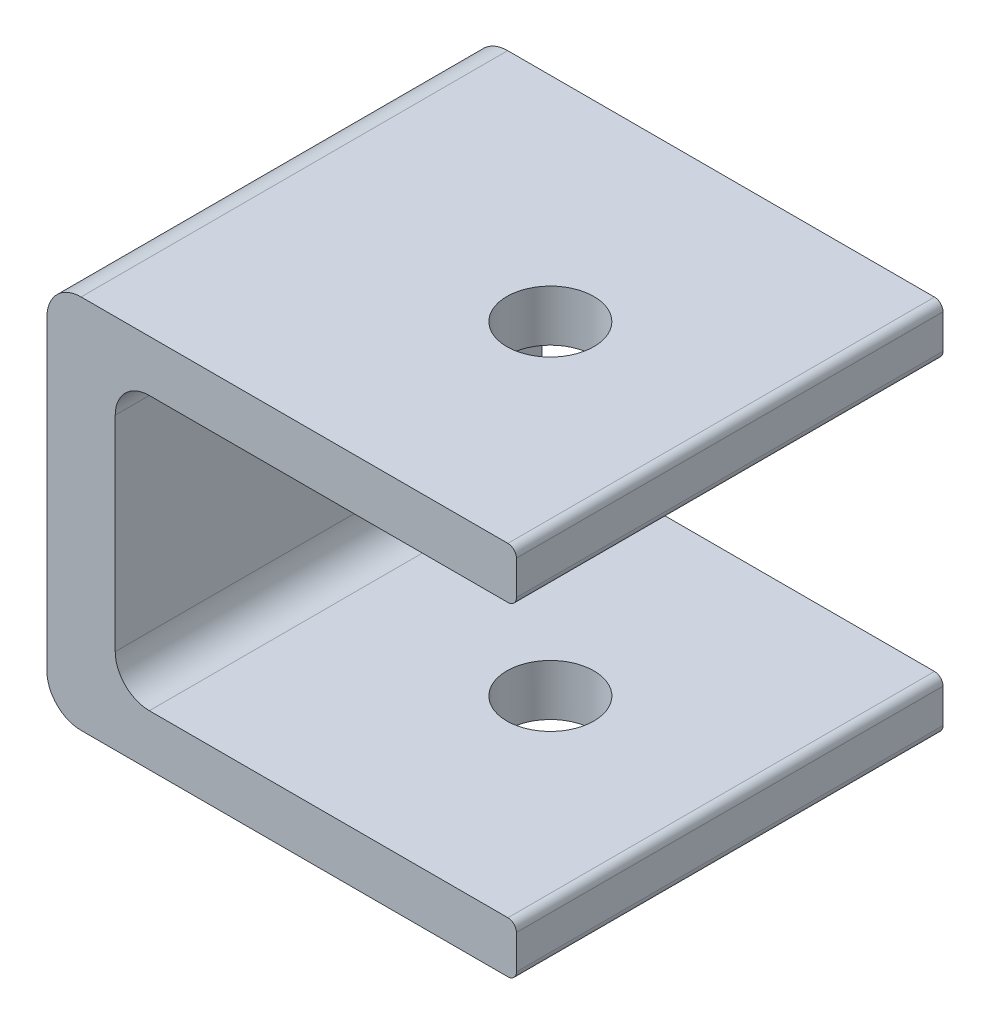
ISO-10303-21;
HEADER;
FILE_DESCRIPTION(('STEP AP214'),'2;1');
FILE_NAME('part.step','',(''),(''),'','','');
FILE_SCHEMA(('AUTOMOTIVE_DESIGN { 1 0 10303 214 1 1 1 1 }'));
ENDSEC;
DATA;
#1=APPLICATION_CONTEXT('core data for automotive mechanical design processes');
#2=APPLICATION_PROTOCOL_DEFINITION('international standard','automotive_design',2000,#1);
#3=PRODUCT_CONTEXT('',#1,'mechanical');
#4=PRODUCT('Part','Part','',(#3));
#5=PRODUCT_RELATED_PRODUCT_CATEGORY('part','',(#4));
#6=PRODUCT_DEFINITION_FORMATION('','',#4);
#7=PRODUCT_DEFINITION_CONTEXT('part definition',#1,'design');
#8=PRODUCT_DEFINITION('design','',#6,#7);
#9=PRODUCT_DEFINITION_SHAPE('','',#8);
#10=(LENGTH_UNIT() NAMED_UNIT(*) SI_UNIT(.MILLI.,.METRE.));
#11=(NAMED_UNIT(*) PLANE_ANGLE_UNIT() SI_UNIT($,.RADIAN.));
#12=(NAMED_UNIT(*) SI_UNIT($,.STERADIAN.) SOLID_ANGLE_UNIT());
#13=UNCERTAINTY_MEASURE_WITH_UNIT(LENGTH_MEASURE(1.E-05),#10,'distance_accuracy_value','');
#14=(GEOMETRIC_REPRESENTATION_CONTEXT(3) GLOBAL_UNCERTAINTY_ASSIGNED_CONTEXT((#13)) GLOBAL_UNIT_ASSIGNED_CONTEXT((#10,
#11,#12)) REPRESENTATION_CONTEXT('',''));
#15=CARTESIAN_POINT('',(0.,0.,0.));
#16=DIRECTION('',(0.,0.,1.));
#17=DIRECTION('',(1.,0.,0.));
#18=AXIS2_PLACEMENT_3D('',#15,#16,#17);
#19=CARTESIAN_POINT('',(0.,0.,25.));
#20=DIRECTION('',(-1.,0.,0.));
#21=DIRECTION('',(0.,-1.,0.));
#22=AXIS2_PLACEMENT_3D('',#19,#20,#21);
#23=PLANE('',#22);
#24=CARTESIAN_POINT('',(0.,-8.,12.5));
#25=DIRECTION('',(-1.,0.,0.));
#26=DIRECTION('',(0.,-1.,0.));
#27=AXIS2_PLACEMENT_3D('',#24,#25,#26);
#28=CIRCLE('',#27,2.55);
#29=CARTESIAN_POINT('',(0.,-10.55,12.5));
#30=VERTEX_POINT('',#29);
#31=EDGE_CURVE('E186',#30,#30,#28,.T.);
#32=ORIENTED_EDGE('',*,*,#31,.T.);
#33=EDGE_LOOP('',(#32));
#34=FACE_BOUND('',#33,.T.);
#35=DIRECTION('',(0.,1.,0.));
#36=VECTOR('',#35,1.);
#37=CARTESIAN_POINT('',(0.,0.,0.));
#38=LINE('',#37,#36);
#39=CARTESIAN_POINT('',(0.,-14.,0.));
#40=VERTEX_POINT('',#39);
#41=CARTESIAN_POINT('',(0.,-2.,0.));
#42=VERTEX_POINT('',#41);
#43=EDGE_CURVE('E185',#40,#42,#38,.T.);
#44=ORIENTED_EDGE('',*,*,#43,.T.);
#45=DIRECTION('',(0.,0.,-1.));
#46=VECTOR('',#45,1.);
#47=CARTESIAN_POINT('',(0.,-2.,25.));
#48=LINE('',#47,#46);
#49=CARTESIAN_POINT('',(0.,-2.,25.));
#50=VERTEX_POINT('',#49);
#51=EDGE_CURVE('E158',#42,#50,#48,.F.);
#52=ORIENTED_EDGE('',*,*,#51,.T.);
#53=DIRECTION('',(0.,1.,0.));
#54=VECTOR('',#53,1.);
#55=CARTESIAN_POINT('',(0.,0.,25.));
#56=LINE('',#55,#54);
#57=CARTESIAN_POINT('',(0.,-14.,25.));
#58=VERTEX_POINT('',#57);
#59=EDGE_CURVE('E202',#58,#50,#56,.T.);
#60=ORIENTED_EDGE('',*,*,#59,.F.);
#61=DIRECTION('',(0.,0.,-1.));
#62=VECTOR('',#61,1.);
#63=CARTESIAN_POINT('',(0.,-14.,0.));
#64=LINE('',#63,#62);
#65=EDGE_CURVE('E178',#58,#40,#64,.T.);
#66=ORIENTED_EDGE('',*,*,#65,.T.);
#67=EDGE_LOOP('',(#44,#52,#60,#66));
#68=FACE_BOUND('',#67,.T.);
#69=ADVANCED_FACE('F39',(#34,#68),#23,.F.);
#70=CARTESIAN_POINT('',(0.,0.,25.));
#71=DIRECTION('',(0.,1.,0.));
#72=DIRECTION('',(0.,0.,1.));
#73=AXIS2_PLACEMENT_3D('',#70,#71,#72);
#74=PLANE('',#73);
#75=CARTESIAN_POINT('',(13.,0.,12.5));
#76=DIRECTION('',(0.,1.,0.));
#77=DIRECTION('',(0.,0.,1.));
#78=AXIS2_PLACEMENT_3D('',#75,#76,#77);
#79=CIRCLE('',#78,2.55);
#80=CARTESIAN_POINT('',(13.,0.,15.05));
#81=VERTEX_POINT('',#80);
#82=EDGE_CURVE('E461',#81,#81,#79,.T.);
#83=ORIENTED_EDGE('',*,*,#82,.T.);
#84=EDGE_LOOP('',(#83));
#85=FACE_BOUND('',#84,.T.);
#86=DIRECTION('',(1.,0.,0.));
#87=VECTOR('',#86,1.);
#88=CARTESIAN_POINT('',(0.,0.,0.));
#89=LINE('',#88,#87);
#90=CARTESIAN_POINT('',(2.,0.,0.));
#91=VERTEX_POINT('',#90);
#92=CARTESIAN_POINT('',(23.0126202099511,0.,0.));
#93=VERTEX_POINT('',#92);
#94=EDGE_CURVE('E175',#91,#93,#89,.T.);
#95=ORIENTED_EDGE('',*,*,#94,.T.);
#96=DIRECTION('',(0.,0.,-1.));
#97=VECTOR('',#96,1.);
#98=CARTESIAN_POINT('',(23.0126202099512,0.,25.));
#99=LINE('',#98,#97);
#100=CARTESIAN_POINT('',(23.0126202099511,0.,25.));
#101=VERTEX_POINT('',#100);
#102=EDGE_CURVE('E48',#93,#101,#99,.F.);
#103=ORIENTED_EDGE('',*,*,#102,.T.);
#104=DIRECTION('',(1.,0.,0.));
#105=VECTOR('',#104,1.);
#106=CARTESIAN_POINT('',(0.,0.,25.));
#107=LINE('',#106,#105);
#108=CARTESIAN_POINT('',(2.,0.,25.));
#109=VERTEX_POINT('',#108);
#110=EDGE_CURVE('E172',#109,#101,#107,.T.);
#111=ORIENTED_EDGE('',*,*,#110,.F.);
#112=DIRECTION('',(0.,0.,-1.));
#113=VECTOR('',#112,1.);
#114=CARTESIAN_POINT('',(2.,0.,0.));
#115=LINE('',#114,#113);
#116=EDGE_CURVE('E159',#109,#91,#115,.T.);
#117=ORIENTED_EDGE('',*,*,#116,.T.);
#118=EDGE_LOOP('',(#95,#103,#111,#117));
#119=FACE_BOUND('',#118,.T.);
#120=ADVANCED_FACE('F173',(#85,#119),#74,.F.);
#121=CARTESIAN_POINT('',(23.5126202099512,0.,25.));
#122=DIRECTION('',(-1.,0.,0.));
#123=DIRECTION('',(0.,-1.,0.));
#124=AXIS2_PLACEMENT_3D('',#121,#122,#123);
#125=PLANE('',#124);
#126=DIRECTION('',(0.,1.,0.));
#127=VECTOR('',#126,1.);
#128=CARTESIAN_POINT('',(23.5126202099512,0.,25.));
#129=LINE('',#128,#127);
#130=CARTESIAN_POINT('',(23.5126202099512,0.5,25.));
#131=VERTEX_POINT('',#130);
#132=CARTESIAN_POINT('',(23.5126202099511,2.5,25.));
#133=VERTEX_POINT('',#132);
#134=EDGE_CURVE('E267',#131,#133,#129,.T.);
#135=ORIENTED_EDGE('',*,*,#134,.F.);
#136=DIRECTION('',(0.,0.,-1.));
#137=VECTOR('',#136,1.);
#138=CARTESIAN_POINT('',(23.5126202099512,0.5,25.));
#139=LINE('',#138,#137);
#140=CARTESIAN_POINT('',(23.5126202099512,0.5,0.));
#141=VERTEX_POINT('',#140);
#142=EDGE_CURVE('E263',#131,#141,#139,.T.);
#143=ORIENTED_EDGE('',*,*,#142,.T.);
#144=DIRECTION('',(0.,1.,0.));
#145=VECTOR('',#144,1.);
#146=CARTESIAN_POINT('',(23.5126202099512,0.,0.));
#147=LINE('',#146,#145);
#148=CARTESIAN_POINT('',(23.5126202099511,2.5,0.));
#149=VERTEX_POINT('',#148);
#150=EDGE_CURVE('E181',#141,#149,#147,.T.);
#151=ORIENTED_EDGE('',*,*,#150,.T.);
#152=DIRECTION('',(0.,0.,-1.));
#153=VECTOR('',#152,1.);
#154=CARTESIAN_POINT('',(23.5126202099511,2.5,25.));
#155=LINE('',#154,#153);
#156=EDGE_CURVE('E65',#149,#133,#155,.F.);
#157=ORIENTED_EDGE('',*,*,#156,.T.);
#158=EDGE_LOOP('',(#135,#143,#151,#157));
#159=FACE_BOUND('',#158,.T.);
#160=ADVANCED_FACE('F273',(#159),#125,.F.);
#161=CARTESIAN_POINT('',(0.,3.,25.));
#162=DIRECTION('',(0.,-1.,0.));
#163=DIRECTION('',(0.,0.,-1.));
#164=AXIS2_PLACEMENT_3D('',#161,#162,#163);
#165=PLANE('',#164);
#166=CARTESIAN_POINT('',(13.,3.,12.5));
#167=DIRECTION('',(0.,1.,0.));
#168=DIRECTION('',(0.,0.,1.));
#169=AXIS2_PLACEMENT_3D('',#166,#167,#168);
#170=CIRCLE('',#169,2.55);
#171=CARTESIAN_POINT('',(13.,3.,15.05));
#172=VERTEX_POINT('',#171);
#173=EDGE_CURVE('E464',#172,#172,#170,.T.);
#174=ORIENTED_EDGE('',*,*,#173,.F.);
#175=EDGE_LOOP('',(#174));
#176=FACE_BOUND('',#175,.T.);
#177=DIRECTION('',(-1.,0.,0.));
#178=VECTOR('',#177,1.);
#179=CARTESIAN_POINT('',(0.,3.,25.));
#180=LINE('',#179,#178);
#181=CARTESIAN_POINT('',(23.0126202099511,3.,25.));
#182=VERTEX_POINT('',#181);
#183=CARTESIAN_POINT('',(-2.,3.,25.));
#184=VERTEX_POINT('',#183);
#185=EDGE_CURVE('E278',#182,#184,#180,.T.);
#186=ORIENTED_EDGE('',*,*,#185,.F.);
#187=DIRECTION('',(0.,0.,-1.));
#188=VECTOR('',#187,1.);
#189=CARTESIAN_POINT('',(23.0126202099511,3.,25.));
#190=LINE('',#189,#188);
#191=CARTESIAN_POINT('',(23.0126202099511,3.,0.));
#192=VERTEX_POINT('',#191);
#193=EDGE_CURVE('E11',#182,#192,#190,.T.);
#194=ORIENTED_EDGE('',*,*,#193,.T.);
#195=DIRECTION('',(-1.,0.,0.));
#196=VECTOR('',#195,1.);
#197=CARTESIAN_POINT('',(0.,3.,0.));
#198=LINE('',#197,#196);
#199=CARTESIAN_POINT('',(-2.,3.,0.));
#200=VERTEX_POINT('',#199);
#201=EDGE_CURVE('E188',#192,#200,#198,.T.);
#202=ORIENTED_EDGE('',*,*,#201,.T.);
#203=DIRECTION('',(0.,0.,-1.));
#204=VECTOR('',#203,1.);
#205=CARTESIAN_POINT('',(-2.,3.,25.));
#206=LINE('',#205,#204);
#207=EDGE_CURVE('E166',#200,#184,#206,.F.);
#208=ORIENTED_EDGE('',*,*,#207,.T.);
#209=EDGE_LOOP('',(#186,#194,#202,#208));
#210=FACE_BOUND('',#209,.T.);
#211=ADVANCED_FACE('F277',(#176,#210),#165,.F.);
#212=CARTESIAN_POINT('',(-4.,3.,25.));
#213=DIRECTION('',(1.,0.,0.));
#214=DIRECTION('',(0.,1.,0.));
#215=AXIS2_PLACEMENT_3D('',#212,#213,#214);
#216=PLANE('',#215);
#217=CARTESIAN_POINT('',(-4.,-8.,12.5));
#218=DIRECTION('',(-1.,0.,0.));
#219=DIRECTION('',(0.,-1.,0.));
#220=AXIS2_PLACEMENT_3D('',#217,#218,#219);
#221=CIRCLE('',#220,2.55);
#222=CARTESIAN_POINT('',(-4.,-10.55,12.5));
#223=VERTEX_POINT('',#222);
#224=EDGE_CURVE('E468',#223,#223,#221,.T.);
#225=ORIENTED_EDGE('',*,*,#224,.F.);
#226=EDGE_LOOP('',(#225));
#227=FACE_BOUND('',#226,.T.);
#228=DIRECTION('',(0.,-1.,0.));
#229=VECTOR('',#228,1.);
#230=CARTESIAN_POINT('',(-4.,3.,0.));
#231=LINE('',#230,#229);
#232=CARTESIAN_POINT('',(-4.,1.,0.));
#233=VERTEX_POINT('',#232);
#234=CARTESIAN_POINT('',(-4.,-17.,0.));
#235=VERTEX_POINT('',#234);
#236=EDGE_CURVE('E193',#233,#235,#231,.T.);
#237=ORIENTED_EDGE('',*,*,#236,.T.);
#238=DIRECTION('',(0.,0.,-1.));
#239=VECTOR('',#238,1.);
#240=CARTESIAN_POINT('',(-4.,-17.,25.));
#241=LINE('',#240,#239);
#242=CARTESIAN_POINT('',(-4.,-17.,25.));
#243=VERTEX_POINT('',#242);
#244=EDGE_CURVE('E225',#235,#243,#241,.F.);
#245=ORIENTED_EDGE('',*,*,#244,.T.);
#246=DIRECTION('',(0.,-1.,0.));
#247=VECTOR('',#246,1.);
#248=CARTESIAN_POINT('',(-4.,3.,25.));
#249=LINE('',#248,#247);
#250=CARTESIAN_POINT('',(-4.,1.,25.));
#251=VERTEX_POINT('',#250);
#252=EDGE_CURVE('E285',#251,#243,#249,.T.);
#253=ORIENTED_EDGE('',*,*,#252,.F.);
#254=DIRECTION('',(0.,0.,-1.));
#255=VECTOR('',#254,1.);
#256=CARTESIAN_POINT('',(-4.,1.,25.));
#257=LINE('',#256,#255);
#258=EDGE_CURVE('E218',#251,#233,#257,.T.);
#259=ORIENTED_EDGE('',*,*,#258,.T.);
#260=EDGE_LOOP('',(#237,#245,#253,#259));
#261=FACE_BOUND('',#260,.T.);
#262=ADVANCED_FACE('F352',(#227,#261),#216,.F.);
#263=CARTESIAN_POINT('',(0.,-19.,25.));
#264=DIRECTION('',(0.,1.,0.));
#265=DIRECTION('',(0.,0.,1.));
#266=AXIS2_PLACEMENT_3D('',#263,#264,#265);
#267=PLANE('',#266);
#268=CARTESIAN_POINT('',(13.,-19.,12.5));
#269=DIRECTION('',(0.,1.,0.));
#270=DIRECTION('',(0.,0.,1.));
#271=AXIS2_PLACEMENT_3D('',#268,#269,#270);
#272=CIRCLE('',#271,2.55);
#273=CARTESIAN_POINT('',(13.,-19.,15.05));
#274=VERTEX_POINT('',#273);
#275=EDGE_CURVE('E458',#274,#274,#272,.T.);
#276=ORIENTED_EDGE('',*,*,#275,.T.);
#277=EDGE_LOOP('',(#276));
#278=FACE_BOUND('',#277,.T.);
#279=DIRECTION('',(1.,0.,0.));
#280=VECTOR('',#279,1.);
#281=CARTESIAN_POINT('',(0.,-19.,0.));
#282=LINE('',#281,#280);
#283=CARTESIAN_POINT('',(-2.,-19.,0.));
#284=VERTEX_POINT('',#283);
#285=CARTESIAN_POINT('',(23.0126202099511,-19.,0.));
#286=VERTEX_POINT('',#285);
#287=EDGE_CURVE('E196',#284,#286,#282,.T.);
#288=ORIENTED_EDGE('',*,*,#287,.T.);
#289=DIRECTION('',(0.,0.,-1.));
#290=VECTOR('',#289,1.);
#291=CARTESIAN_POINT('',(23.0126202099512,-19.,25.));
#292=LINE('',#291,#290);
#293=CARTESIAN_POINT('',(23.0126202099512,-19.,25.));
#294=VERTEX_POINT('',#293);
#295=EDGE_CURVE('E246',#286,#294,#292,.F.);
#296=ORIENTED_EDGE('',*,*,#295,.T.);
#297=DIRECTION('',(1.,0.,0.));
#298=VECTOR('',#297,1.);
#299=CARTESIAN_POINT('',(0.,-19.,25.));
#300=LINE('',#299,#298);
#301=CARTESIAN_POINT('',(-2.,-19.,25.));
#302=VERTEX_POINT('',#301);
#303=EDGE_CURVE('E283',#302,#294,#300,.T.);
#304=ORIENTED_EDGE('',*,*,#303,.F.);
#305=DIRECTION('',(0.,0.,-1.));
#306=VECTOR('',#305,1.);
#307=CARTESIAN_POINT('',(-2.,-19.,25.));
#308=LINE('',#307,#306);
#309=EDGE_CURVE('E214',#302,#284,#308,.T.);
#310=ORIENTED_EDGE('',*,*,#309,.T.);
#311=EDGE_LOOP('',(#288,#296,#304,#310));
#312=FACE_BOUND('',#311,.T.);
#313=ADVANCED_FACE('F358',(#278,#312),#267,.F.);
#314=CARTESIAN_POINT('',(23.5126202099512,-19.,25.));
#315=DIRECTION('',(-1.,0.,0.));
#316=DIRECTION('',(0.,-1.,0.));
#317=AXIS2_PLACEMENT_3D('',#314,#315,#316);
#318=PLANE('',#317);
#319=DIRECTION('',(0.,1.,0.));
#320=VECTOR('',#319,1.);
#321=CARTESIAN_POINT('',(23.5126202099512,-19.,25.));
#322=LINE('',#321,#320);
#323=CARTESIAN_POINT('',(23.5126202099512,-18.5,25.));
#324=VERTEX_POINT('',#323);
#325=CARTESIAN_POINT('',(23.5126202099511,-16.5,25.));
#326=VERTEX_POINT('',#325);
#327=EDGE_CURVE('E287',#324,#326,#322,.T.);
#328=ORIENTED_EDGE('',*,*,#327,.F.);
#329=DIRECTION('',(0.,0.,-1.));
#330=VECTOR('',#329,1.);
#331=CARTESIAN_POINT('',(23.5126202099512,-18.5,25.));
#332=LINE('',#331,#330);
#333=CARTESIAN_POINT('',(23.5126202099512,-18.5,0.));
#334=VERTEX_POINT('',#333);
#335=EDGE_CURVE('E240',#324,#334,#332,.T.);
#336=ORIENTED_EDGE('',*,*,#335,.T.);
#337=DIRECTION('',(0.,1.,0.));
#338=VECTOR('',#337,1.);
#339=CARTESIAN_POINT('',(23.5126202099512,-19.,0.));
#340=LINE('',#339,#338);
#341=CARTESIAN_POINT('',(23.5126202099511,-16.5,0.));
#342=VERTEX_POINT('',#341);
#343=EDGE_CURVE('E197',#334,#342,#340,.T.);
#344=ORIENTED_EDGE('',*,*,#343,.T.);
#345=DIRECTION('',(0.,0.,-1.));
#346=VECTOR('',#345,1.);
#347=CARTESIAN_POINT('',(23.5126202099511,-16.5,25.));
#348=LINE('',#347,#346);
#349=EDGE_CURVE('E239',#342,#326,#348,.F.);
#350=ORIENTED_EDGE('',*,*,#349,.T.);
#351=EDGE_LOOP('',(#328,#336,#344,#350));
#352=FACE_BOUND('',#351,.T.);
#353=ADVANCED_FACE('F309',(#352),#318,.F.);
#354=CARTESIAN_POINT('',(0.,-16.,25.));
#355=DIRECTION('',(0.,-1.,0.));
#356=DIRECTION('',(0.,0.,-1.));
#357=AXIS2_PLACEMENT_3D('',#354,#355,#356);
#358=PLANE('',#357);
#359=CARTESIAN_POINT('',(13.,-16.,12.5));
#360=DIRECTION('',(0.,-1.,0.));
#361=DIRECTION('',(0.,0.,-1.));
#362=AXIS2_PLACEMENT_3D('',#359,#360,#361);
#363=CIRCLE('',#362,2.55);
#364=CARTESIAN_POINT('',(13.,-16.,9.95));
#365=VERTEX_POINT('',#364);
#366=EDGE_CURVE('E43',#365,#365,#363,.T.);
#367=ORIENTED_EDGE('',*,*,#366,.T.);
#368=EDGE_LOOP('',(#367));
#369=FACE_BOUND('',#368,.T.);
#370=DIRECTION('',(-1.,0.,0.));
#371=VECTOR('',#370,1.);
#372=CARTESIAN_POINT('',(0.,-16.,25.));
#373=LINE('',#372,#371);
#374=CARTESIAN_POINT('',(23.0126202099511,-16.,25.));
#375=VERTEX_POINT('',#374);
#376=CARTESIAN_POINT('',(2.,-16.,25.));
#377=VERTEX_POINT('',#376);
#378=EDGE_CURVE('E179',#375,#377,#373,.T.);
#379=ORIENTED_EDGE('',*,*,#378,.F.);
#380=DIRECTION('',(0.,0.,-1.));
#381=VECTOR('',#380,1.);
#382=CARTESIAN_POINT('',(23.0126202099511,-16.,25.));
#383=LINE('',#382,#381);
#384=CARTESIAN_POINT('',(23.0126202099511,-16.,0.));
#385=VERTEX_POINT('',#384);
#386=EDGE_CURVE('E257',#375,#385,#383,.T.);
#387=ORIENTED_EDGE('',*,*,#386,.T.);
#388=DIRECTION('',(-1.,0.,0.));
#389=VECTOR('',#388,1.);
#390=CARTESIAN_POINT('',(0.,-16.,0.));
#391=LINE('',#390,#389);
#392=CARTESIAN_POINT('',(2.,-16.,0.));
#393=VERTEX_POINT('',#392);
#394=EDGE_CURVE('E205',#385,#393,#391,.T.);
#395=ORIENTED_EDGE('',*,*,#394,.T.);
#396=DIRECTION('',(0.,0.,-1.));
#397=VECTOR('',#396,1.);
#398=CARTESIAN_POINT('',(2.,-16.,25.));
#399=LINE('',#398,#397);
#400=EDGE_CURVE('E209',#393,#377,#399,.F.);
#401=ORIENTED_EDGE('',*,*,#400,.T.);
#402=EDGE_LOOP('',(#379,#387,#395,#401));
#403=FACE_BOUND('',#402,.T.);
#404=ADVANCED_FACE('F299',(#369,#403),#358,.F.);
#405=CARTESIAN_POINT('',(0.,0.,25.));
#406=DIRECTION('',(0.,0.,1.));
#407=DIRECTION('',(1.,0.,0.));
#408=AXIS2_PLACEMENT_3D('',#405,#406,#407);
#409=PLANE('',#408);
#410=ORIENTED_EDGE('',*,*,#303,.T.);
#411=CARTESIAN_POINT('',(23.0126202099512,-18.5,25.));
#412=DIRECTION('',(0.,0.,1.));
#413=DIRECTION('',(1.,0.,0.));
#414=AXIS2_PLACEMENT_3D('',#411,#412,#413);
#415=CIRCLE('',#414,0.5);
#416=EDGE_CURVE('E251',#294,#324,#415,.T.);
#417=ORIENTED_EDGE('',*,*,#416,.T.);
#418=ORIENTED_EDGE('',*,*,#327,.T.);
#419=CARTESIAN_POINT('',(23.0126202099511,-16.5,25.));
#420=DIRECTION('',(0.,0.,1.));
#421=DIRECTION('',(1.,0.,0.));
#422=AXIS2_PLACEMENT_3D('',#419,#420,#421);
#423=CIRCLE('',#422,0.5);
#424=EDGE_CURVE('E252',#326,#375,#423,.T.);
#425=ORIENTED_EDGE('',*,*,#424,.T.);
#426=ORIENTED_EDGE('',*,*,#378,.T.);
#427=CARTESIAN_POINT('',(2.,-14.,25.));
#428=DIRECTION('',(0.,0.,1.));
#429=DIRECTION('',(1.,0.,0.));
#430=AXIS2_PLACEMENT_3D('',#427,#428,#429);
#431=CIRCLE('',#430,2.);
#432=EDGE_CURVE('E234',#377,#58,#431,.F.);
#433=ORIENTED_EDGE('',*,*,#432,.T.);
#434=ORIENTED_EDGE('',*,*,#59,.T.);
#435=CARTESIAN_POINT('',(2.,-2.,25.));
#436=DIRECTION('',(0.,0.,1.));
#437=DIRECTION('',(1.,0.,0.));
#438=AXIS2_PLACEMENT_3D('',#435,#436,#437);
#439=CIRCLE('',#438,2.);
#440=EDGE_CURVE('E162',#50,#109,#439,.F.);
#441=ORIENTED_EDGE('',*,*,#440,.T.);
#442=ORIENTED_EDGE('',*,*,#110,.T.);
#443=CARTESIAN_POINT('',(23.0126202099512,0.5,25.));
#444=DIRECTION('',(0.,0.,1.));
#445=DIRECTION('',(1.,0.,0.));
#446=AXIS2_PLACEMENT_3D('',#443,#444,#445);
#447=CIRCLE('',#446,0.5);
#448=EDGE_CURVE('E253',#101,#131,#447,.T.);
#449=ORIENTED_EDGE('',*,*,#448,.T.);
#450=ORIENTED_EDGE('',*,*,#134,.T.);
#451=CARTESIAN_POINT('',(23.0126202099511,2.5,25.));
#452=DIRECTION('',(0.,0.,1.));
#453=DIRECTION('',(1.,0.,0.));
#454=AXIS2_PLACEMENT_3D('',#451,#452,#453);
#455=CIRCLE('',#454,0.5);
#456=EDGE_CURVE('E54',#133,#182,#455,.T.);
#457=ORIENTED_EDGE('',*,*,#456,.T.);
#458=ORIENTED_EDGE('',*,*,#185,.T.);
#459=CARTESIAN_POINT('',(-2.,1.,25.));
#460=DIRECTION('',(0.,0.,1.));
#461=DIRECTION('',(1.,0.,0.));
#462=AXIS2_PLACEMENT_3D('',#459,#460,#461);
#463=CIRCLE('',#462,2.);
#464=EDGE_CURVE('E224',#184,#251,#463,.T.);
#465=ORIENTED_EDGE('',*,*,#464,.T.);
#466=ORIENTED_EDGE('',*,*,#252,.T.);
#467=CARTESIAN_POINT('',(-2.,-17.,25.));
#468=DIRECTION('',(0.,0.,1.));
#469=DIRECTION('',(1.,0.,0.));
#470=AXIS2_PLACEMENT_3D('',#467,#468,#469);
#471=CIRCLE('',#470,2.);
#472=EDGE_CURVE('E228',#243,#302,#471,.T.);
#473=ORIENTED_EDGE('',*,*,#472,.T.);
#474=EDGE_LOOP('',(#410,#417,#418,#425,#426,#433,#434,#441,#442,#449,#450,#457,#458,#465,#466,#473));
#475=FACE_BOUND('',#474,.T.);
#476=ADVANCED_FACE('F270',(#475),#409,.T.);
#477=CARTESIAN_POINT('',(0.,0.,0.));
#478=DIRECTION('',(0.,0.,1.));
#479=DIRECTION('',(1.,0.,0.));
#480=AXIS2_PLACEMENT_3D('',#477,#478,#479);
#481=PLANE('',#480);
#482=ORIENTED_EDGE('',*,*,#343,.F.);
#483=CARTESIAN_POINT('',(23.0126202099512,-18.5,0.));
#484=DIRECTION('',(0.,0.,1.));
#485=DIRECTION('',(1.,0.,0.));
#486=AXIS2_PLACEMENT_3D('',#483,#484,#485);
#487=CIRCLE('',#486,0.5);
#488=EDGE_CURVE('E248',#334,#286,#487,.F.);
#489=ORIENTED_EDGE('',*,*,#488,.T.);
#490=ORIENTED_EDGE('',*,*,#287,.F.);
#491=CARTESIAN_POINT('',(-2.,-17.,0.));
#492=DIRECTION('',(0.,0.,1.));
#493=DIRECTION('',(1.,0.,0.));
#494=AXIS2_PLACEMENT_3D('',#491,#492,#493);
#495=CIRCLE('',#494,2.);
#496=EDGE_CURVE('E217',#284,#235,#495,.F.);
#497=ORIENTED_EDGE('',*,*,#496,.T.);
#498=ORIENTED_EDGE('',*,*,#236,.F.);
#499=CARTESIAN_POINT('',(-2.,1.,0.));
#500=DIRECTION('',(0.,0.,1.));
#501=DIRECTION('',(1.,0.,0.));
#502=AXIS2_PLACEMENT_3D('',#499,#500,#501);
#503=CIRCLE('',#502,2.);
#504=EDGE_CURVE('E213',#233,#200,#503,.F.);
#505=ORIENTED_EDGE('',*,*,#504,.T.);
#506=ORIENTED_EDGE('',*,*,#201,.F.);
#507=CARTESIAN_POINT('',(23.0126202099511,2.5,0.));
#508=DIRECTION('',(0.,0.,1.));
#509=DIRECTION('',(1.,0.,0.));
#510=AXIS2_PLACEMENT_3D('',#507,#508,#509);
#511=CIRCLE('',#510,0.5);
#512=EDGE_CURVE('E241',#192,#149,#511,.F.);
#513=ORIENTED_EDGE('',*,*,#512,.T.);
#514=ORIENTED_EDGE('',*,*,#150,.F.);
#515=CARTESIAN_POINT('',(23.0126202099512,0.5,0.));
#516=DIRECTION('',(0.,0.,1.));
#517=DIRECTION('',(1.,0.,0.));
#518=AXIS2_PLACEMENT_3D('',#515,#516,#517);
#519=CIRCLE('',#518,0.5);
#520=EDGE_CURVE('E182',#141,#93,#519,.F.);
#521=ORIENTED_EDGE('',*,*,#520,.T.);
#522=ORIENTED_EDGE('',*,*,#94,.F.);
#523=CARTESIAN_POINT('',(2.,-2.,0.));
#524=DIRECTION('',(0.,0.,1.));
#525=DIRECTION('',(1.,0.,0.));
#526=AXIS2_PLACEMENT_3D('',#523,#524,#525);
#527=CIRCLE('',#526,2.);
#528=EDGE_CURVE('E151',#91,#42,#527,.T.);
#529=ORIENTED_EDGE('',*,*,#528,.T.);
#530=ORIENTED_EDGE('',*,*,#43,.F.);
#531=CARTESIAN_POINT('',(2.,-14.,0.));
#532=DIRECTION('',(0.,0.,1.));
#533=DIRECTION('',(1.,0.,0.));
#534=AXIS2_PLACEMENT_3D('',#531,#532,#533);
#535=CIRCLE('',#534,2.);
#536=EDGE_CURVE('E232',#40,#393,#535,.T.);
#537=ORIENTED_EDGE('',*,*,#536,.T.);
#538=ORIENTED_EDGE('',*,*,#394,.F.);
#539=CARTESIAN_POINT('',(23.0126202099511,-16.5,0.));
#540=DIRECTION('',(0.,0.,1.));
#541=DIRECTION('',(1.,0.,0.));
#542=AXIS2_PLACEMENT_3D('',#539,#540,#541);
#543=CIRCLE('',#542,0.5);
#544=EDGE_CURVE('E243',#385,#342,#543,.F.);
#545=ORIENTED_EDGE('',*,*,#544,.T.);
#546=EDGE_LOOP('',(#482,#489,#490,#497,#498,#505,#506,#513,#514,#521,#522,#529,#530,#537,#538,#545));
#547=FACE_BOUND('',#546,.T.);
#548=ADVANCED_FACE('F176',(#547),#481,.F.);
#549=CARTESIAN_POINT('',(1.,-8.,12.5));
#550=DIRECTION('',(-1.,0.,0.));
#551=DIRECTION('',(0.,-1.,0.));
#552=AXIS2_PLACEMENT_3D('',#549,#550,#551);
#553=CYLINDRICAL_SURFACE('',#552,2.55);
#554=ORIENTED_EDGE('',*,*,#224,.T.);
#555=EDGE_LOOP('',(#554));
#556=FACE_BOUND('',#555,.T.);
#557=ORIENTED_EDGE('',*,*,#31,.F.);
#558=EDGE_LOOP('',(#557));
#559=FACE_BOUND('',#558,.T.);
#560=ADVANCED_FACE('F340',(#556,#559),#553,.F.);
#561=CARTESIAN_POINT('',(2.,-2.,25.));
#562=DIRECTION('',(0.,0.,1.));
#563=DIRECTION('',(1.,0.,0.));
#564=AXIS2_PLACEMENT_3D('',#561,#562,#563);
#565=CYLINDRICAL_SURFACE('',#564,2.);
#566=ORIENTED_EDGE('',*,*,#440,.F.);
#567=ORIENTED_EDGE('',*,*,#51,.F.);
#568=ORIENTED_EDGE('',*,*,#528,.F.);
#569=ORIENTED_EDGE('',*,*,#116,.F.);
#570=EDGE_LOOP('',(#566,#567,#568,#569));
#571=FACE_BOUND('',#570,.T.);
#572=ADVANCED_FACE('F156',(#571),#565,.F.);
#573=CARTESIAN_POINT('',(2.,-14.,25.));
#574=DIRECTION('',(0.,0.,1.));
#575=DIRECTION('',(1.,0.,0.));
#576=AXIS2_PLACEMENT_3D('',#573,#574,#575);
#577=CYLINDRICAL_SURFACE('',#576,2.);
#578=ORIENTED_EDGE('',*,*,#432,.F.);
#579=ORIENTED_EDGE('',*,*,#400,.F.);
#580=ORIENTED_EDGE('',*,*,#536,.F.);
#581=ORIENTED_EDGE('',*,*,#65,.F.);
#582=EDGE_LOOP('',(#578,#579,#580,#581));
#583=FACE_BOUND('',#582,.T.);
#584=ADVANCED_FACE('F302',(#583),#577,.F.);
#585=CARTESIAN_POINT('',(-2.,-17.,25.));
#586=DIRECTION('',(0.,0.,-1.));
#587=DIRECTION('',(-1.,0.,0.));
#588=AXIS2_PLACEMENT_3D('',#585,#586,#587);
#589=CYLINDRICAL_SURFACE('',#588,2.);
#590=ORIENTED_EDGE('',*,*,#472,.F.);
#591=ORIENTED_EDGE('',*,*,#244,.F.);
#592=ORIENTED_EDGE('',*,*,#496,.F.);
#593=ORIENTED_EDGE('',*,*,#309,.F.);
#594=EDGE_LOOP('',(#590,#591,#592,#593));
#595=FACE_BOUND('',#594,.T.);
#596=ADVANCED_FACE('F337',(#595),#589,.T.);
#597=CARTESIAN_POINT('',(-2.,1.,25.));
#598=DIRECTION('',(0.,0.,-1.));
#599=DIRECTION('',(-1.,0.,0.));
#600=AXIS2_PLACEMENT_3D('',#597,#598,#599);
#601=CYLINDRICAL_SURFACE('',#600,2.);
#602=ORIENTED_EDGE('',*,*,#464,.F.);
#603=ORIENTED_EDGE('',*,*,#207,.F.);
#604=ORIENTED_EDGE('',*,*,#504,.F.);
#605=ORIENTED_EDGE('',*,*,#258,.F.);
#606=EDGE_LOOP('',(#602,#603,#604,#605));
#607=FACE_BOUND('',#606,.T.);
#608=ADVANCED_FACE('F318',(#607),#601,.T.);
#609=CARTESIAN_POINT('',(23.0126202099512,-18.5,25.));
#610=DIRECTION('',(0.,0.,-1.));
#611=DIRECTION('',(-1.,0.,0.));
#612=AXIS2_PLACEMENT_3D('',#609,#610,#611);
#613=CYLINDRICAL_SURFACE('',#612,0.5);
#614=ORIENTED_EDGE('',*,*,#416,.F.);
#615=ORIENTED_EDGE('',*,*,#295,.F.);
#616=ORIENTED_EDGE('',*,*,#488,.F.);
#617=ORIENTED_EDGE('',*,*,#335,.F.);
#618=EDGE_LOOP('',(#614,#615,#616,#617));
#619=FACE_BOUND('',#618,.T.);
#620=ADVANCED_FACE('F315',(#619),#613,.T.);
#621=CARTESIAN_POINT('',(23.0126202099511,-16.5,25.));
#622=DIRECTION('',(0.,0.,-1.));
#623=DIRECTION('',(-1.,0.,0.));
#624=AXIS2_PLACEMENT_3D('',#621,#622,#623);
#625=CYLINDRICAL_SURFACE('',#624,0.5);
#626=ORIENTED_EDGE('',*,*,#424,.F.);
#627=ORIENTED_EDGE('',*,*,#349,.F.);
#628=ORIENTED_EDGE('',*,*,#544,.F.);
#629=ORIENTED_EDGE('',*,*,#386,.F.);
#630=EDGE_LOOP('',(#626,#627,#628,#629));
#631=FACE_BOUND('',#630,.T.);
#632=ADVANCED_FACE('F314',(#631),#625,.T.);
#633=CARTESIAN_POINT('',(23.0126202099512,0.5,25.));
#634=DIRECTION('',(0.,0.,-1.));
#635=DIRECTION('',(-1.,0.,0.));
#636=AXIS2_PLACEMENT_3D('',#633,#634,#635);
#637=CYLINDRICAL_SURFACE('',#636,0.5);
#638=ORIENTED_EDGE('',*,*,#448,.F.);
#639=ORIENTED_EDGE('',*,*,#102,.F.);
#640=ORIENTED_EDGE('',*,*,#520,.F.);
#641=ORIENTED_EDGE('',*,*,#142,.F.);
#642=EDGE_LOOP('',(#638,#639,#640,#641));
#643=FACE_BOUND('',#642,.T.);
#644=ADVANCED_FACE('F275',(#643),#637,.T.);
#645=CARTESIAN_POINT('',(23.0126202099511,2.5,25.));
#646=DIRECTION('',(0.,0.,-1.));
#647=DIRECTION('',(-1.,0.,0.));
#648=AXIS2_PLACEMENT_3D('',#645,#646,#647);
#649=CYLINDRICAL_SURFACE('',#648,0.5);
#650=ORIENTED_EDGE('',*,*,#456,.F.);
#651=ORIENTED_EDGE('',*,*,#156,.F.);
#652=ORIENTED_EDGE('',*,*,#512,.F.);
#653=ORIENTED_EDGE('',*,*,#193,.F.);
#654=EDGE_LOOP('',(#650,#651,#652,#653));
#655=FACE_BOUND('',#654,.T.);
#656=ADVANCED_FACE('F41',(#655),#649,.T.);
#657=CARTESIAN_POINT('',(13.,-32.,12.5));
#658=DIRECTION('',(0.,1.,0.));
#659=DIRECTION('',(0.,0.,1.));
#660=AXIS2_PLACEMENT_3D('',#657,#658,#659);
#661=CYLINDRICAL_SURFACE('',#660,2.55);
#662=ORIENTED_EDGE('',*,*,#366,.F.);
#663=EDGE_LOOP('',(#662));
#664=FACE_BOUND('',#663,.T.);
#665=ORIENTED_EDGE('',*,*,#275,.F.);
#666=EDGE_LOOP('',(#665));
#667=FACE_BOUND('',#666,.T.);
#668=ADVANCED_FACE('F435',(#664,#667),#661,.F.);
#669=ORIENTED_EDGE('',*,*,#173,.T.);
#670=EDGE_LOOP('',(#669));
#671=FACE_BOUND('',#670,.T.);
#672=ORIENTED_EDGE('',*,*,#82,.F.);
#673=EDGE_LOOP('',(#672));
#674=FACE_BOUND('',#673,.T.);
#675=ADVANCED_FACE('F437',(#671,#674),#661,.F.);
#676=CLOSED_SHELL('',(#69,#120,#160,#211,#262,#313,#353,#404,#476,#548,#560,#572,#584,#596,#608,
#620,#632,#644,#656,#668,#675));
#677=MANIFOLD_SOLID_BREP('B2',#676);
#678=ADVANCED_BREP_SHAPE_REPRESENTATION('',(#18,#677),#14);
#679=SHAPE_DEFINITION_REPRESENTATION(#9,#678);
ENDSEC;
END-ISO-10303-21;
